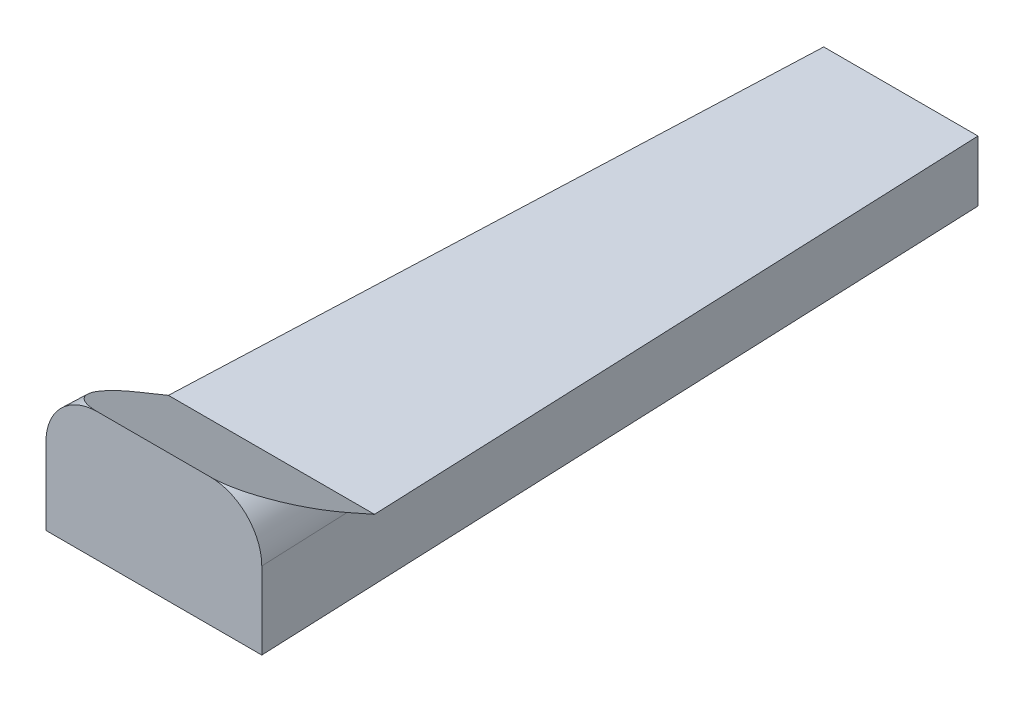
ISO-10303-21;
HEADER;
FILE_DESCRIPTION(('STEP AP214'),'2;1');
FILE_NAME('part.step','',(''),(''),'','','');
FILE_SCHEMA(('AUTOMOTIVE_DESIGN { 1 0 10303 214 1 1 1 1 }'));
ENDSEC;
DATA;
#1=APPLICATION_CONTEXT('core data for automotive mechanical design processes');
#2=APPLICATION_PROTOCOL_DEFINITION('international standard','automotive_design',2000,#1);
#3=PRODUCT_CONTEXT('',#1,'mechanical');
#4=PRODUCT('Part','Part','',(#3));
#5=PRODUCT_RELATED_PRODUCT_CATEGORY('part','',(#4));
#6=PRODUCT_DEFINITION_FORMATION('','',#4);
#7=PRODUCT_DEFINITION_CONTEXT('part definition',#1,'design');
#8=PRODUCT_DEFINITION('design','',#6,#7);
#9=PRODUCT_DEFINITION_SHAPE('','',#8);
#10=(LENGTH_UNIT() NAMED_UNIT(*) SI_UNIT(.MILLI.,.METRE.));
#11=(NAMED_UNIT(*) PLANE_ANGLE_UNIT() SI_UNIT($,.RADIAN.));
#12=(NAMED_UNIT(*) SI_UNIT($,.STERADIAN.) SOLID_ANGLE_UNIT());
#13=UNCERTAINTY_MEASURE_WITH_UNIT(LENGTH_MEASURE(1.E-05),#10,'distance_accuracy_value','');
#14=(GEOMETRIC_REPRESENTATION_CONTEXT(3) GLOBAL_UNCERTAINTY_ASSIGNED_CONTEXT((#13)) GLOBAL_UNIT_ASSIGNED_CONTEXT((#10,
#11,#12)) REPRESENTATION_CONTEXT('',''));
#15=CARTESIAN_POINT('',(0.,0.,0.));
#16=DIRECTION('',(0.,0.,1.));
#17=DIRECTION('',(1.,0.,0.));
#18=AXIS2_PLACEMENT_3D('',#15,#16,#17);
#19=CARTESIAN_POINT('',(0.,19.05,0.));
#20=DIRECTION('',(0.,1.,0.));
#21=DIRECTION('',(0.,0.,1.));
#22=AXIS2_PLACEMENT_3D('',#19,#20,#21);
#23=PLANE('',#22);
#24=DIRECTION('',(1.,0.,0.));
#25=VECTOR('',#24,1.);
#26=CARTESIAN_POINT('',(0.,19.05,-1152.2456));
#27=LINE('',#26,#25);
#28=CARTESIAN_POINT('',(-19.05,19.05,-1152.2456));
#29=VERTEX_POINT('',#28);
#30=CARTESIAN_POINT('',(19.05,19.05,-1152.2456));
#31=VERTEX_POINT('',#30);
#32=EDGE_CURVE('E11',#29,#31,#27,.T.);
#33=ORIENTED_EDGE('',*,*,#32,.T.);
#34=DIRECTION('',(-0.0411377422918955,0.,-0.999153484785559));
#35=VECTOR('',#34,1.);
#36=CARTESIAN_POINT('',(66.3784184874971,19.05,-2.73297177567099));
#37=LINE('',#36,#35);
#38=CARTESIAN_POINT('',(26.6456892184653,19.05,-967.761500261916));
#39=VERTEX_POINT('',#38);
#40=EDGE_CURVE('E215',#39,#31,#37,.T.);
#41=ORIENTED_EDGE('',*,*,#40,.F.);
#42=DIRECTION('',(-1.,0.,0.));
#43=VECTOR('',#42,1.);
#44=CARTESIAN_POINT('',(0.,19.05,-967.761500261916));
#45=LINE('',#44,#43);
#46=CARTESIAN_POINT('',(-26.6456892184653,19.05,-967.761500261916));
#47=VERTEX_POINT('',#46);
#48=EDGE_CURVE('E54',#39,#47,#45,.T.);
#49=ORIENTED_EDGE('',*,*,#48,.T.);
#50=DIRECTION('',(-0.0411377422918956,0.,0.999153484785559));
#51=VECTOR('',#50,1.);
#52=CARTESIAN_POINT('',(-66.3784184874971,19.05,-2.732971775671));
#53=LINE('',#52,#51);
#54=EDGE_CURVE('E61',#29,#47,#53,.T.);
#55=ORIENTED_EDGE('',*,*,#54,.F.);
#56=EDGE_LOOP('',(#33,#41,#49,#55));
#57=FACE_BOUND('',#56,.T.);
#58=ADVANCED_FACE('F45',(#57),#23,.F.);
#59=CARTESIAN_POINT('',(-37.9388116569906,38.1,-384.755207199316));
#60=DIRECTION('',(0.0411377422918956,0.,-0.999153484785559));
#61=DIRECTION('',(-0.999153484785559,0.,-0.0411377422918956));
#62=AXIS2_PLACEMENT_3D('',#59,#60,#61);
#63=CYLINDRICAL_SURFACE('',#62,12.7);
#64=DIRECTION('',(-0.0411377422918956,0.,0.999153484785559));
#65=VECTOR('',#64,1.);
#66=CARTESIAN_POINT('',(-19.05,38.1,-1152.2456));
#67=LINE('',#66,#65);
#68=CARTESIAN_POINT('',(-26.6456892184653,38.1,-967.761500261916));
#69=VERTEX_POINT('',#68);
#70=CARTESIAN_POINT('',(-25.7400137714904,38.1,-989.75854551804));
#71=VERTEX_POINT('',#70);
#72=EDGE_CURVE('E105',#69,#71,#67,.F.);
#73=ORIENTED_EDGE('',*,*,#72,.F.);
#74=CARTESIAN_POINT('',(-13.9349293668638,38.1,-967.761500261916));
#75=DIRECTION('',(0.,0.,1.));
#76=DIRECTION('',(1.,0.,0.));
#77=AXIS2_PLACEMENT_3D('',#74,#75,#76);
#78=ELLIPSE('',#77,12.7107598516015,12.7);
#79=CARTESIAN_POINT('',(-13.9349293668638,50.8,-967.761500261916));
#80=VERTEX_POINT('',#79);
#81=EDGE_CURVE('E108',#69,#80,#78,.F.);
#82=ORIENTED_EDGE('',*,*,#81,.T.);
#83=CARTESIAN_POINT('',(-13.029253919889,38.1,-989.75854551804));
#84=DIRECTION('',(0.,-0.866025403784438,0.500000000000001));
#85=DIRECTION('',(0.0474883808531933,-0.499435895206769,-0.865048345621767));
#86=AXIS2_PLACEMENT_3D('',#83,#84,#85);
#87=ELLIPSE('',#86,25.4215197032029,12.7);
#88=EDGE_CURVE('E110',#71,#80,#87,.F.);
#89=ORIENTED_EDGE('',*,*,#88,.F.);
#90=EDGE_LOOP('',(#73,#82,#89));
#91=FACE_BOUND('',#90,.T.);
#92=ADVANCED_FACE('F107',(#91),#63,.T.);
#93=CARTESIAN_POINT('',(53.6891692307205,38.1,-2.21052244856392));
#94=DIRECTION('',(-0.0411377422918955,0.,-0.999153484785559));
#95=DIRECTION('',(-0.999153484785559,0.,0.0411377422918955));
#96=AXIS2_PLACEMENT_3D('',#93,#94,#95);
#97=CYLINDRICAL_SURFACE('',#96,12.7);
#98=CARTESIAN_POINT('',(13.029253919889,38.1,-989.75854551804));
#99=DIRECTION('',(0.,-0.866025403784438,0.500000000000001));
#100=DIRECTION('',(-0.0474883808531932,-0.499435895206769,-0.865048345621767));
#101=AXIS2_PLACEMENT_3D('',#98,#99,#100);
#102=ELLIPSE('',#101,25.4215197032029,12.7);
#103=CARTESIAN_POINT('',(13.9349293668638,50.8,-967.761500261916));
#104=VERTEX_POINT('',#103);
#105=CARTESIAN_POINT('',(25.7400137714904,38.1,-989.75854551804));
#106=VERTEX_POINT('',#105);
#107=EDGE_CURVE('E138',#104,#106,#102,.F.);
#108=ORIENTED_EDGE('',*,*,#107,.F.);
#109=CARTESIAN_POINT('',(13.9349293668638,38.1,-967.761500261916));
#110=DIRECTION('',(0.,0.,1.));
#111=DIRECTION('',(-1.,0.,0.));
#112=AXIS2_PLACEMENT_3D('',#109,#110,#111);
#113=ELLIPSE('',#112,12.7107598516015,12.7);
#114=CARTESIAN_POINT('',(26.6456892184653,38.1,-967.761500261916));
#115=VERTEX_POINT('',#114);
#116=EDGE_CURVE('E122',#104,#115,#113,.F.);
#117=ORIENTED_EDGE('',*,*,#116,.T.);
#118=DIRECTION('',(0.0411377422918955,0.,0.999153484785559));
#119=VECTOR('',#118,1.);
#120=CARTESIAN_POINT('',(50.8000000000001,38.1,-381.101599999996));
#121=LINE('',#120,#119);
#122=EDGE_CURVE('E113',#106,#115,#121,.T.);
#123=ORIENTED_EDGE('',*,*,#122,.F.);
#124=EDGE_LOOP('',(#108,#117,#123));
#125=FACE_BOUND('',#124,.T.);
#126=ADVANCED_FACE('F162',(#125),#97,.T.);
#127=CARTESIAN_POINT('',(-177.8508,34.036,-996.7976));
#128=DIRECTION('',(0.,-0.866025403784438,0.500000000000001));
#129=DIRECTION('',(0.,-0.500000000000001,-0.866025403784438));
#130=AXIS2_PLACEMENT_3D('',#127,#128,#129);
#131=PLANE('',#130);
#132=ORIENTED_EDGE('',*,*,#88,.T.);
#133=DIRECTION('',(1.,0.,0.));
#134=VECTOR('',#133,1.);
#135=CARTESIAN_POINT('',(-177.8508,50.8,-967.761500261916));
#136=LINE('',#135,#134);
#137=EDGE_CURVE('E120',#80,#104,#136,.T.);
#138=ORIENTED_EDGE('',*,*,#137,.T.);
#139=ORIENTED_EDGE('',*,*,#107,.T.);
#140=DIRECTION('',(0.0356338686377124,0.499682456017297,0.865475401472758));
#141=VECTOR('',#140,1.);
#142=CARTESIAN_POINT('',(55.5533236078045,456.162603094628,-265.652876213644));
#143=LINE('',#142,#141);
#144=CARTESIAN_POINT('',(25.4501976284585,34.0359999999999,-996.7976));
#145=VERTEX_POINT('',#144);
#146=EDGE_CURVE('E205',#145,#106,#143,.T.);
#147=ORIENTED_EDGE('',*,*,#146,.F.);
#148=DIRECTION('',(1.,0.,0.));
#149=VECTOR('',#148,1.);
#150=CARTESIAN_POINT('',(-177.8508,34.036,-996.7976));
#151=LINE('',#150,#149);
#152=CARTESIAN_POINT('',(-25.4501976284585,34.036,-996.7976));
#153=VERTEX_POINT('',#152);
#154=EDGE_CURVE('E216',#153,#145,#151,.T.);
#155=ORIENTED_EDGE('',*,*,#154,.F.);
#156=DIRECTION('',(0.0356338686377124,-0.499682456017297,-0.865475401472758));
#157=VECTOR('',#156,1.);
#158=CARTESIAN_POINT('',(-55.5533236078045,456.162603094628,-265.652876213644));
#159=LINE('',#158,#157);
#160=EDGE_CURVE('E222',#71,#153,#159,.T.);
#161=ORIENTED_EDGE('',*,*,#160,.F.);
#162=EDGE_LOOP('',(#132,#138,#139,#147,#155,#161));
#163=FACE_BOUND('',#162,.T.);
#164=ADVANCED_FACE('F158',(#163),#131,.F.);
#165=CARTESIAN_POINT('',(-177.8508,34.036,-1152.2456));
#166=DIRECTION('',(0.,-1.,0.));
#167=DIRECTION('',(0.,0.,-1.));
#168=AXIS2_PLACEMENT_3D('',#165,#166,#167);
#169=PLANE('',#168);
#170=DIRECTION('',(1.,0.,0.));
#171=VECTOR('',#170,1.);
#172=CARTESIAN_POINT('',(-177.8508,34.036,-1152.2456));
#173=LINE('',#172,#171);
#174=CARTESIAN_POINT('',(-19.05,34.036,-1152.2456));
#175=VERTEX_POINT('',#174);
#176=CARTESIAN_POINT('',(19.05,34.036,-1152.2456));
#177=VERTEX_POINT('',#176);
#178=EDGE_CURVE('E211',#175,#177,#173,.T.);
#179=ORIENTED_EDGE('',*,*,#178,.F.);
#180=DIRECTION('',(0.0411377422918956,0.,-0.999153484785559));
#181=VECTOR('',#180,1.);
#182=CARTESIAN_POINT('',(-66.3784184874971,34.0359999999999,-2.73297177567099));
#183=LINE('',#182,#181);
#184=EDGE_CURVE('E121',#153,#175,#183,.T.);
#185=ORIENTED_EDGE('',*,*,#184,.F.);
#186=ORIENTED_EDGE('',*,*,#154,.T.);
#187=DIRECTION('',(0.0411377422918955,0.,0.999153484785559));
#188=VECTOR('',#187,1.);
#189=CARTESIAN_POINT('',(66.3784184874971,34.0359999999999,-2.73297177567099));
#190=LINE('',#189,#188);
#191=EDGE_CURVE('E210',#177,#145,#190,.T.);
#192=ORIENTED_EDGE('',*,*,#191,.F.);
#193=EDGE_LOOP('',(#179,#185,#186,#192));
#194=FACE_BOUND('',#193,.T.);
#195=ADVANCED_FACE('F156',(#194),#169,.F.);
#196=CARTESIAN_POINT('',(0.,0.,-1152.2456));
#197=DIRECTION('',(0.,0.,-1.));
#198=DIRECTION('',(-1.,0.,0.));
#199=AXIS2_PLACEMENT_3D('',#196,#197,#198);
#200=PLANE('',#199);
#201=ORIENTED_EDGE('',*,*,#32,.F.);
#202=DIRECTION('',(0.,1.,0.));
#203=VECTOR('',#202,1.);
#204=CARTESIAN_POINT('',(-19.05,50.8,-1152.2456));
#205=LINE('',#204,#203);
#206=EDGE_CURVE('E225',#29,#175,#205,.T.);
#207=ORIENTED_EDGE('',*,*,#206,.T.);
#208=ORIENTED_EDGE('',*,*,#178,.T.);
#209=DIRECTION('',(0.,-1.,0.));
#210=VECTOR('',#209,1.);
#211=CARTESIAN_POINT('',(19.05,50.8,-1152.2456));
#212=LINE('',#211,#210);
#213=EDGE_CURVE('E48',#177,#31,#212,.T.);
#214=ORIENTED_EDGE('',*,*,#213,.T.);
#215=EDGE_LOOP('',(#201,#207,#208,#214));
#216=FACE_BOUND('',#215,.T.);
#217=ADVANCED_FACE('F147',(#216),#200,.T.);
#218=CARTESIAN_POINT('',(0.,0.,-967.761500261916));
#219=DIRECTION('',(0.,0.,1.));
#220=DIRECTION('',(1.,0.,0.));
#221=AXIS2_PLACEMENT_3D('',#218,#219,#220);
#222=PLANE('',#221);
#223=ORIENTED_EDGE('',*,*,#48,.F.);
#224=DIRECTION('',(0.,1.,0.));
#225=VECTOR('',#224,1.);
#226=CARTESIAN_POINT('',(26.6456892184653,0.,-967.761500261916));
#227=LINE('',#226,#225);
#228=EDGE_CURVE('E125',#39,#115,#227,.T.);
#229=ORIENTED_EDGE('',*,*,#228,.T.);
#230=ORIENTED_EDGE('',*,*,#116,.F.);
#231=ORIENTED_EDGE('',*,*,#137,.F.);
#232=ORIENTED_EDGE('',*,*,#81,.F.);
#233=DIRECTION('',(0.,-1.,0.));
#234=VECTOR('',#233,1.);
#235=CARTESIAN_POINT('',(-26.6456892184653,0.,-967.761500261916));
#236=LINE('',#235,#234);
#237=EDGE_CURVE('E118',#69,#47,#236,.T.);
#238=ORIENTED_EDGE('',*,*,#237,.T.);
#239=EDGE_LOOP('',(#223,#229,#230,#231,#232,#238));
#240=FACE_BOUND('',#239,.T.);
#241=ADVANCED_FACE('F117',(#240),#222,.T.);
#242=CARTESIAN_POINT('',(66.3784184874971,0.,-2.73297177567099));
#243=DIRECTION('',(-0.999153484785559,0.,0.0411377422918955));
#244=DIRECTION('',(0.0411377422918955,0.,0.999153484785559));
#245=AXIS2_PLACEMENT_3D('',#242,#243,#244);
#246=PLANE('',#245);
#247=ORIENTED_EDGE('',*,*,#228,.F.);
#248=ORIENTED_EDGE('',*,*,#40,.T.);
#249=ORIENTED_EDGE('',*,*,#213,.F.);
#250=ORIENTED_EDGE('',*,*,#191,.T.);
#251=ORIENTED_EDGE('',*,*,#146,.T.);
#252=ORIENTED_EDGE('',*,*,#122,.T.);
#253=EDGE_LOOP('',(#247,#248,#249,#250,#251,#252));
#254=FACE_BOUND('',#253,.T.);
#255=ADVANCED_FACE('F169',(#254),#246,.F.);
#256=CARTESIAN_POINT('',(-66.3784184874971,0.,-2.732971775671));
#257=DIRECTION('',(0.999153484785559,0.,0.0411377422918956));
#258=DIRECTION('',(0.0411377422918956,0.,-0.999153484785559));
#259=AXIS2_PLACEMENT_3D('',#256,#257,#258);
#260=PLANE('',#259);
#261=ORIENTED_EDGE('',*,*,#206,.F.);
#262=ORIENTED_EDGE('',*,*,#54,.T.);
#263=ORIENTED_EDGE('',*,*,#237,.F.);
#264=ORIENTED_EDGE('',*,*,#72,.T.);
#265=ORIENTED_EDGE('',*,*,#160,.T.);
#266=ORIENTED_EDGE('',*,*,#184,.T.);
#267=EDGE_LOOP('',(#261,#262,#263,#264,#265,#266));
#268=FACE_BOUND('',#267,.T.);
#269=ADVANCED_FACE('F124',(#268),#260,.F.);
#270=CLOSED_SHELL('',(#58,#92,#126,#164,#195,#217,#241,#255,#269));
#271=MANIFOLD_SOLID_BREP('B2',#270);
#272=ADVANCED_BREP_SHAPE_REPRESENTATION('',(#18,#271),#14);
#273=SHAPE_DEFINITION_REPRESENTATION(#9,#272);
ENDSEC;
END-ISO-10303-21;
